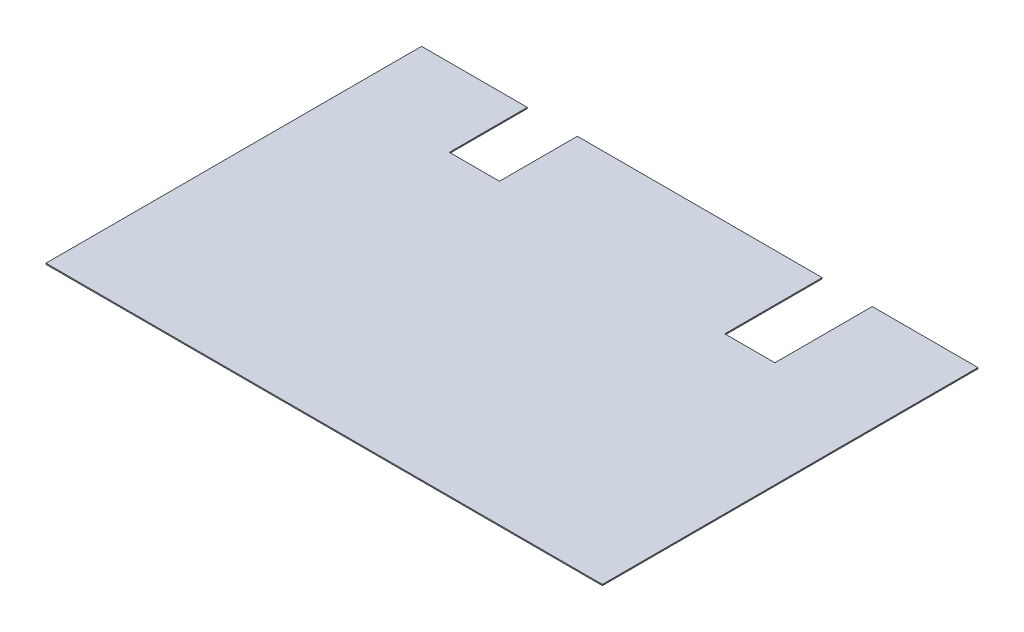
ISO-10303-21;
HEADER;
FILE_DESCRIPTION(('STEP AP214'),'2;1');
FILE_NAME('part.step','',(''),(''),'','','');
FILE_SCHEMA(('AUTOMOTIVE_DESIGN { 1 0 10303 214 1 1 1 1 }'));
ENDSEC;
DATA;
#1=APPLICATION_CONTEXT('core data for automotive mechanical design processes');
#2=APPLICATION_PROTOCOL_DEFINITION('international standard','automotive_design',2000,#1);
#3=PRODUCT_CONTEXT('',#1,'mechanical');
#4=PRODUCT('Part','Part','',(#3));
#5=PRODUCT_RELATED_PRODUCT_CATEGORY('part','',(#4));
#6=PRODUCT_DEFINITION_FORMATION('','',#4);
#7=PRODUCT_DEFINITION_CONTEXT('part definition',#1,'design');
#8=PRODUCT_DEFINITION('design','',#6,#7);
#9=PRODUCT_DEFINITION_SHAPE('','',#8);
#10=(LENGTH_UNIT() NAMED_UNIT(*) SI_UNIT(.MILLI.,.METRE.));
#11=(NAMED_UNIT(*) PLANE_ANGLE_UNIT() SI_UNIT($,.RADIAN.));
#12=(NAMED_UNIT(*) SI_UNIT($,.STERADIAN.) SOLID_ANGLE_UNIT());
#13=UNCERTAINTY_MEASURE_WITH_UNIT(LENGTH_MEASURE(1.E-05),#10,'distance_accuracy_value','');
#14=(GEOMETRIC_REPRESENTATION_CONTEXT(3) GLOBAL_UNCERTAINTY_ASSIGNED_CONTEXT((#13)) GLOBAL_UNIT_ASSIGNED_CONTEXT((#10,
#11,#12)) REPRESENTATION_CONTEXT('',''));
#15=CARTESIAN_POINT('',(0.,0.,0.));
#16=DIRECTION('',(0.,0.,1.));
#17=DIRECTION('',(1.,0.,0.));
#18=AXIS2_PLACEMENT_3D('',#15,#16,#17);
#19=CARTESIAN_POINT('',(0.,0.0508,-17.145));
#20=DIRECTION('',(0.,0.,1.));
#21=DIRECTION('',(1.,0.,0.));
#22=AXIS2_PLACEMENT_3D('',#19,#20,#21);
#23=PLANE('',#22);
#24=DIRECTION('',(-1.,0.,0.));
#25=VECTOR('',#24,1.);
#26=CARTESIAN_POINT('',(0.,0.0508,-17.145));
#27=LINE('',#26,#25);
#28=CARTESIAN_POINT('',(18.288,0.0508,-17.145));
#29=VERTEX_POINT('',#28);
#30=CARTESIAN_POINT('',(7.112,0.0508,-17.145));
#31=VERTEX_POINT('',#30);
#32=EDGE_CURVE('E195',#29,#31,#27,.T.);
#33=ORIENTED_EDGE('',*,*,#32,.F.);
#34=DIRECTION('',(0.,1.,0.));
#35=VECTOR('',#34,1.);
#36=CARTESIAN_POINT('',(18.288,0.,-17.145));
#37=LINE('',#36,#35);
#38=CARTESIAN_POINT('',(18.288,0.,-17.145));
#39=VERTEX_POINT('',#38);
#40=EDGE_CURVE('E151',#39,#29,#37,.T.);
#41=ORIENTED_EDGE('',*,*,#40,.F.);
#42=DIRECTION('',(-1.,0.,0.));
#43=VECTOR('',#42,1.);
#44=CARTESIAN_POINT('',(0.,0.,-17.145));
#45=LINE('',#44,#43);
#46=CARTESIAN_POINT('',(7.112,0.,-17.145));
#47=VERTEX_POINT('',#46);
#48=EDGE_CURVE('E142',#39,#47,#45,.T.);
#49=ORIENTED_EDGE('',*,*,#48,.T.);
#50=DIRECTION('',(0.,1.,0.));
#51=VECTOR('',#50,1.);
#52=CARTESIAN_POINT('',(7.112,0.,-17.145));
#53=LINE('',#52,#51);
#54=EDGE_CURVE('E165',#47,#31,#53,.T.);
#55=ORIENTED_EDGE('',*,*,#54,.T.);
#56=EDGE_LOOP('',(#33,#41,#49,#55));
#57=FACE_BOUND('',#56,.T.);
#58=ADVANCED_FACE('F33',(#57),#23,.F.);
#59=CARTESIAN_POINT('',(25.4,0.,-17.145));
#60=VERTEX_POINT('',#59);
#61=CARTESIAN_POINT('',(20.574,0.,-17.145));
#62=VERTEX_POINT('',#61);
#63=EDGE_CURVE('E186',#60,#62,#45,.T.);
#64=ORIENTED_EDGE('',*,*,#63,.T.);
#65=DIRECTION('',(0.,1.,0.));
#66=VECTOR('',#65,1.);
#67=CARTESIAN_POINT('',(20.574,0.,-17.145));
#68=LINE('',#67,#66);
#69=CARTESIAN_POINT('',(20.574,0.0508,-17.145));
#70=VERTEX_POINT('',#69);
#71=EDGE_CURVE('E154',#62,#70,#68,.T.);
#72=ORIENTED_EDGE('',*,*,#71,.T.);
#73=CARTESIAN_POINT('',(25.4,0.0508,-17.145));
#74=VERTEX_POINT('',#73);
#75=EDGE_CURVE('E191',#74,#70,#27,.T.);
#76=ORIENTED_EDGE('',*,*,#75,.F.);
#77=DIRECTION('',(0.,-1.,0.));
#78=VECTOR('',#77,1.);
#79=CARTESIAN_POINT('',(25.4,0.0508,-17.145));
#80=LINE('',#79,#78);
#81=EDGE_CURVE('E207',#74,#60,#80,.T.);
#82=ORIENTED_EDGE('',*,*,#81,.T.);
#83=EDGE_LOOP('',(#64,#72,#76,#82));
#84=FACE_BOUND('',#83,.T.);
#85=ADVANCED_FACE('F220',(#84),#23,.F.);
#86=CARTESIAN_POINT('',(0.,0.0508,0.));
#87=DIRECTION('',(1.,0.,0.));
#88=DIRECTION('',(0.,0.,-1.));
#89=AXIS2_PLACEMENT_3D('',#86,#87,#88);
#90=PLANE('',#89);
#91=DIRECTION('',(0.,0.,1.));
#92=VECTOR('',#91,1.);
#93=CARTESIAN_POINT('',(0.,0.,0.));
#94=LINE('',#93,#92);
#95=CARTESIAN_POINT('',(0.,0.,-17.145));
#96=VERTEX_POINT('',#95);
#97=CARTESIAN_POINT('',(0.,0.,0.));
#98=VERTEX_POINT('',#97);
#99=EDGE_CURVE('E175',#96,#98,#94,.T.);
#100=ORIENTED_EDGE('',*,*,#99,.T.);
#101=DIRECTION('',(0.,-1.,0.));
#102=VECTOR('',#101,1.);
#103=CARTESIAN_POINT('',(0.,0.0508,0.));
#104=LINE('',#103,#102);
#105=CARTESIAN_POINT('',(0.,0.0508,0.));
#106=VERTEX_POINT('',#105);
#107=EDGE_CURVE('E11',#106,#98,#104,.T.);
#108=ORIENTED_EDGE('',*,*,#107,.F.);
#109=DIRECTION('',(0.,0.,1.));
#110=VECTOR('',#109,1.);
#111=CARTESIAN_POINT('',(0.,0.0508,0.));
#112=LINE('',#111,#110);
#113=CARTESIAN_POINT('',(0.,0.0508,-17.145));
#114=VERTEX_POINT('',#113);
#115=EDGE_CURVE('E182',#114,#106,#112,.T.);
#116=ORIENTED_EDGE('',*,*,#115,.F.);
#117=DIRECTION('',(0.,-1.,0.));
#118=VECTOR('',#117,1.);
#119=CARTESIAN_POINT('',(0.,0.0508,-17.145));
#120=LINE('',#119,#118);
#121=EDGE_CURVE('E194',#114,#96,#120,.T.);
#122=ORIENTED_EDGE('',*,*,#121,.T.);
#123=EDGE_LOOP('',(#100,#108,#116,#122));
#124=FACE_BOUND('',#123,.T.);
#125=ADVANCED_FACE('F35',(#124),#90,.F.);
#126=CARTESIAN_POINT('',(0.,0.0508,0.));
#127=DIRECTION('',(0.,0.,-1.));
#128=DIRECTION('',(-1.,0.,0.));
#129=AXIS2_PLACEMENT_3D('',#126,#127,#128);
#130=PLANE('',#129);
#131=DIRECTION('',(1.,0.,0.));
#132=VECTOR('',#131,1.);
#133=CARTESIAN_POINT('',(0.,0.,0.));
#134=LINE('',#133,#132);
#135=CARTESIAN_POINT('',(25.4,0.,0.));
#136=VERTEX_POINT('',#135);
#137=EDGE_CURVE('E198',#98,#136,#134,.T.);
#138=ORIENTED_EDGE('',*,*,#137,.T.);
#139=DIRECTION('',(0.,-1.,0.));
#140=VECTOR('',#139,1.);
#141=CARTESIAN_POINT('',(25.4,0.0508,0.));
#142=LINE('',#141,#140);
#143=CARTESIAN_POINT('',(25.4,0.0508,0.));
#144=VERTEX_POINT('',#143);
#145=EDGE_CURVE('E41',#144,#136,#142,.T.);
#146=ORIENTED_EDGE('',*,*,#145,.F.);
#147=DIRECTION('',(1.,0.,0.));
#148=VECTOR('',#147,1.);
#149=CARTESIAN_POINT('',(0.,0.0508,0.));
#150=LINE('',#149,#148);
#151=EDGE_CURVE('E185',#106,#144,#150,.T.);
#152=ORIENTED_EDGE('',*,*,#151,.F.);
#153=ORIENTED_EDGE('',*,*,#107,.T.);
#154=EDGE_LOOP('',(#138,#146,#152,#153));
#155=FACE_BOUND('',#154,.T.);
#156=ADVANCED_FACE('F227',(#155),#130,.F.);
#157=CARTESIAN_POINT('',(25.4,0.0508,0.));
#158=DIRECTION('',(-1.,0.,0.));
#159=DIRECTION('',(0.,0.,1.));
#160=AXIS2_PLACEMENT_3D('',#157,#158,#159);
#161=PLANE('',#160);
#162=DIRECTION('',(0.,0.,-1.));
#163=VECTOR('',#162,1.);
#164=CARTESIAN_POINT('',(25.4,0.,0.));
#165=LINE('',#164,#163);
#166=EDGE_CURVE('E200',#136,#60,#165,.T.);
#167=ORIENTED_EDGE('',*,*,#166,.T.);
#168=ORIENTED_EDGE('',*,*,#81,.F.);
#169=DIRECTION('',(0.,0.,-1.));
#170=VECTOR('',#169,1.);
#171=CARTESIAN_POINT('',(25.4,0.0508,0.));
#172=LINE('',#171,#170);
#173=EDGE_CURVE('E188',#144,#74,#172,.T.);
#174=ORIENTED_EDGE('',*,*,#173,.F.);
#175=ORIENTED_EDGE('',*,*,#145,.T.);
#176=EDGE_LOOP('',(#167,#168,#174,#175));
#177=FACE_BOUND('',#176,.T.);
#178=ADVANCED_FACE('F214',(#177),#161,.F.);
#179=CARTESIAN_POINT('',(4.826,0.0508,-17.145));
#180=VERTEX_POINT('',#179);
#181=EDGE_CURVE('E190',#180,#114,#27,.T.);
#182=ORIENTED_EDGE('',*,*,#181,.F.);
#183=DIRECTION('',(0.,1.,0.));
#184=VECTOR('',#183,1.);
#185=CARTESIAN_POINT('',(4.826,0.,-17.145));
#186=LINE('',#185,#184);
#187=CARTESIAN_POINT('',(4.826,0.,-17.145));
#188=VERTEX_POINT('',#187);
#189=EDGE_CURVE('E178',#188,#180,#186,.T.);
#190=ORIENTED_EDGE('',*,*,#189,.F.);
#191=EDGE_CURVE('E202',#188,#96,#45,.T.);
#192=ORIENTED_EDGE('',*,*,#191,.T.);
#193=ORIENTED_EDGE('',*,*,#121,.F.);
#194=EDGE_LOOP('',(#182,#190,#192,#193));
#195=FACE_BOUND('',#194,.T.);
#196=ADVANCED_FACE('F243',(#195),#23,.F.);
#197=CARTESIAN_POINT('',(0.,0.0508,0.));
#198=DIRECTION('',(0.,-1.,0.));
#199=DIRECTION('',(0.,0.,-1.));
#200=AXIS2_PLACEMENT_3D('',#197,#198,#199);
#201=PLANE('',#200);
#202=DIRECTION('',(1.,0.,0.));
#203=VECTOR('',#202,1.);
#204=CARTESIAN_POINT('',(18.288,0.0508,-12.7));
#205=LINE('',#204,#203);
#206=CARTESIAN_POINT('',(18.288,0.0508,-12.7));
#207=VERTEX_POINT('',#206);
#208=CARTESIAN_POINT('',(20.574,0.0508,-12.7));
#209=VERTEX_POINT('',#208);
#210=EDGE_CURVE('E145',#207,#209,#205,.T.);
#211=ORIENTED_EDGE('',*,*,#210,.F.);
#212=DIRECTION('',(0.,0.,1.));
#213=VECTOR('',#212,1.);
#214=CARTESIAN_POINT('',(18.288,0.0508,-17.145));
#215=LINE('',#214,#213);
#216=EDGE_CURVE('E128',#29,#207,#215,.T.);
#217=ORIENTED_EDGE('',*,*,#216,.F.);
#218=ORIENTED_EDGE('',*,*,#32,.T.);
#219=DIRECTION('',(0.,0.,-1.));
#220=VECTOR('',#219,1.);
#221=CARTESIAN_POINT('',(7.112,0.0508,-17.145));
#222=LINE('',#221,#220);
#223=CARTESIAN_POINT('',(7.112,0.0508,-13.589));
#224=VERTEX_POINT('',#223);
#225=EDGE_CURVE('E153',#224,#31,#222,.T.);
#226=ORIENTED_EDGE('',*,*,#225,.F.);
#227=DIRECTION('',(1.,0.,0.));
#228=VECTOR('',#227,1.);
#229=CARTESIAN_POINT('',(4.826,0.0508,-13.589));
#230=LINE('',#229,#228);
#231=CARTESIAN_POINT('',(4.826,0.0508,-13.589));
#232=VERTEX_POINT('',#231);
#233=EDGE_CURVE('E161',#232,#224,#230,.T.);
#234=ORIENTED_EDGE('',*,*,#233,.F.);
#235=DIRECTION('',(0.,0.,1.));
#236=VECTOR('',#235,1.);
#237=CARTESIAN_POINT('',(4.826,0.0508,-14.605));
#238=LINE('',#237,#236);
#239=EDGE_CURVE('E168',#180,#232,#238,.T.);
#240=ORIENTED_EDGE('',*,*,#239,.F.);
#241=ORIENTED_EDGE('',*,*,#181,.T.);
#242=ORIENTED_EDGE('',*,*,#115,.T.);
#243=ORIENTED_EDGE('',*,*,#151,.T.);
#244=ORIENTED_EDGE('',*,*,#173,.T.);
#245=ORIENTED_EDGE('',*,*,#75,.T.);
#246=DIRECTION('',(0.,0.,-1.));
#247=VECTOR('',#246,1.);
#248=CARTESIAN_POINT('',(20.574,0.0508,-13.589));
#249=LINE('',#248,#247);
#250=EDGE_CURVE('E143',#209,#70,#249,.T.);
#251=ORIENTED_EDGE('',*,*,#250,.F.);
#252=EDGE_LOOP('',(#211,#217,#218,#226,#234,#240,#241,#242,#243,#244,#245,#251));
#253=FACE_BOUND('',#252,.T.);
#254=ADVANCED_FACE('F224',(#253),#201,.F.);
#255=CARTESIAN_POINT('',(0.,0.,0.));
#256=DIRECTION('',(0.,-1.,0.));
#257=DIRECTION('',(0.,0.,-1.));
#258=AXIS2_PLACEMENT_3D('',#255,#256,#257);
#259=PLANE('',#258);
#260=DIRECTION('',(0.,0.,1.));
#261=VECTOR('',#260,1.);
#262=CARTESIAN_POINT('',(18.288,0.,-17.145));
#263=LINE('',#262,#261);
#264=CARTESIAN_POINT('',(18.288,0.,-12.7));
#265=VERTEX_POINT('',#264);
#266=EDGE_CURVE('E125',#39,#265,#263,.T.);
#267=ORIENTED_EDGE('',*,*,#266,.T.);
#268=DIRECTION('',(1.,0.,0.));
#269=VECTOR('',#268,1.);
#270=CARTESIAN_POINT('',(18.288,0.,-12.7));
#271=LINE('',#270,#269);
#272=CARTESIAN_POINT('',(20.574,0.,-12.7));
#273=VERTEX_POINT('',#272);
#274=EDGE_CURVE('E135',#265,#273,#271,.T.);
#275=ORIENTED_EDGE('',*,*,#274,.T.);
#276=DIRECTION('',(0.,0.,-1.));
#277=VECTOR('',#276,1.);
#278=CARTESIAN_POINT('',(20.574,0.,-13.589));
#279=LINE('',#278,#277);
#280=EDGE_CURVE('E48',#273,#62,#279,.T.);
#281=ORIENTED_EDGE('',*,*,#280,.T.);
#282=ORIENTED_EDGE('',*,*,#63,.F.);
#283=ORIENTED_EDGE('',*,*,#166,.F.);
#284=ORIENTED_EDGE('',*,*,#137,.F.);
#285=ORIENTED_EDGE('',*,*,#99,.F.);
#286=ORIENTED_EDGE('',*,*,#191,.F.);
#287=DIRECTION('',(0.,0.,1.));
#288=VECTOR('',#287,1.);
#289=CARTESIAN_POINT('',(4.826,0.,-14.605));
#290=LINE('',#289,#288);
#291=CARTESIAN_POINT('',(4.826,0.,-13.589));
#292=VERTEX_POINT('',#291);
#293=EDGE_CURVE('E160',#188,#292,#290,.T.);
#294=ORIENTED_EDGE('',*,*,#293,.T.);
#295=DIRECTION('',(1.,0.,0.));
#296=VECTOR('',#295,1.);
#297=CARTESIAN_POINT('',(4.826,0.,-13.589));
#298=LINE('',#297,#296);
#299=CARTESIAN_POINT('',(7.112,0.,-13.589));
#300=VERTEX_POINT('',#299);
#301=EDGE_CURVE('E56',#292,#300,#298,.T.);
#302=ORIENTED_EDGE('',*,*,#301,.T.);
#303=DIRECTION('',(0.,0.,-1.));
#304=VECTOR('',#303,1.);
#305=CARTESIAN_POINT('',(7.112,0.,-17.145));
#306=LINE('',#305,#304);
#307=EDGE_CURVE('E158',#300,#47,#306,.T.);
#308=ORIENTED_EDGE('',*,*,#307,.T.);
#309=ORIENTED_EDGE('',*,*,#48,.F.);
#310=EDGE_LOOP('',(#267,#275,#281,#282,#283,#284,#285,#286,#294,#302,#308,#309));
#311=FACE_BOUND('',#310,.T.);
#312=ADVANCED_FACE('F140',(#311),#259,.T.);
#313=CARTESIAN_POINT('',(7.112,0.,-17.145));
#314=DIRECTION('',(1.,0.,0.));
#315=DIRECTION('',(0.,0.,-1.));
#316=AXIS2_PLACEMENT_3D('',#313,#314,#315);
#317=PLANE('',#316);
#318=ORIENTED_EDGE('',*,*,#225,.T.);
#319=ORIENTED_EDGE('',*,*,#54,.F.);
#320=ORIENTED_EDGE('',*,*,#307,.F.);
#321=DIRECTION('',(0.,1.,0.));
#322=VECTOR('',#321,1.);
#323=CARTESIAN_POINT('',(7.112,0.,-13.589));
#324=LINE('',#323,#322);
#325=EDGE_CURVE('E173',#300,#224,#324,.T.);
#326=ORIENTED_EDGE('',*,*,#325,.T.);
#327=EDGE_LOOP('',(#318,#319,#320,#326));
#328=FACE_BOUND('',#327,.T.);
#329=ADVANCED_FACE('F238',(#328),#317,.F.);
#330=CARTESIAN_POINT('',(4.826,0.,-13.589));
#331=DIRECTION('',(0.,0.,1.));
#332=DIRECTION('',(1.,0.,0.));
#333=AXIS2_PLACEMENT_3D('',#330,#331,#332);
#334=PLANE('',#333);
#335=ORIENTED_EDGE('',*,*,#233,.T.);
#336=ORIENTED_EDGE('',*,*,#325,.F.);
#337=ORIENTED_EDGE('',*,*,#301,.F.);
#338=DIRECTION('',(0.,1.,0.));
#339=VECTOR('',#338,1.);
#340=CARTESIAN_POINT('',(4.826,0.,-13.589));
#341=LINE('',#340,#339);
#342=EDGE_CURVE('E176',#292,#232,#341,.T.);
#343=ORIENTED_EDGE('',*,*,#342,.T.);
#344=EDGE_LOOP('',(#335,#336,#337,#343));
#345=FACE_BOUND('',#344,.T.);
#346=ADVANCED_FACE('F303',(#345),#334,.F.);
#347=CARTESIAN_POINT('',(4.826,0.,-14.605));
#348=DIRECTION('',(-1.,0.,0.));
#349=DIRECTION('',(0.,0.,1.));
#350=AXIS2_PLACEMENT_3D('',#347,#348,#349);
#351=PLANE('',#350);
#352=ORIENTED_EDGE('',*,*,#239,.T.);
#353=ORIENTED_EDGE('',*,*,#342,.F.);
#354=ORIENTED_EDGE('',*,*,#293,.F.);
#355=ORIENTED_EDGE('',*,*,#189,.T.);
#356=EDGE_LOOP('',(#352,#353,#354,#355));
#357=FACE_BOUND('',#356,.T.);
#358=ADVANCED_FACE('F312',(#357),#351,.F.);
#359=CARTESIAN_POINT('',(18.288,0.,-17.145));
#360=DIRECTION('',(-1.,0.,0.));
#361=DIRECTION('',(0.,0.,1.));
#362=AXIS2_PLACEMENT_3D('',#359,#360,#361);
#363=PLANE('',#362);
#364=ORIENTED_EDGE('',*,*,#216,.T.);
#365=DIRECTION('',(0.,1.,0.));
#366=VECTOR('',#365,1.);
#367=CARTESIAN_POINT('',(18.288,0.,-12.7));
#368=LINE('',#367,#366);
#369=EDGE_CURVE('E121',#265,#207,#368,.T.);
#370=ORIENTED_EDGE('',*,*,#369,.F.);
#371=ORIENTED_EDGE('',*,*,#266,.F.);
#372=ORIENTED_EDGE('',*,*,#40,.T.);
#373=EDGE_LOOP('',(#364,#370,#371,#372));
#374=FACE_BOUND('',#373,.T.);
#375=ADVANCED_FACE('F123',(#374),#363,.F.);
#376=CARTESIAN_POINT('',(20.574,0.,-13.589));
#377=DIRECTION('',(1.,0.,0.));
#378=DIRECTION('',(0.,0.,-1.));
#379=AXIS2_PLACEMENT_3D('',#376,#377,#378);
#380=PLANE('',#379);
#381=ORIENTED_EDGE('',*,*,#250,.T.);
#382=ORIENTED_EDGE('',*,*,#71,.F.);
#383=ORIENTED_EDGE('',*,*,#280,.F.);
#384=DIRECTION('',(0.,1.,0.));
#385=VECTOR('',#384,1.);
#386=CARTESIAN_POINT('',(20.574,0.,-12.7));
#387=LINE('',#386,#385);
#388=EDGE_CURVE('E132',#273,#209,#387,.T.);
#389=ORIENTED_EDGE('',*,*,#388,.T.);
#390=EDGE_LOOP('',(#381,#382,#383,#389));
#391=FACE_BOUND('',#390,.T.);
#392=ADVANCED_FACE('F331',(#391),#380,.F.);
#393=CARTESIAN_POINT('',(18.288,0.,-12.7));
#394=DIRECTION('',(0.,0.,1.));
#395=DIRECTION('',(1.,0.,0.));
#396=AXIS2_PLACEMENT_3D('',#393,#394,#395);
#397=PLANE('',#396);
#398=ORIENTED_EDGE('',*,*,#210,.T.);
#399=ORIENTED_EDGE('',*,*,#388,.F.);
#400=ORIENTED_EDGE('',*,*,#274,.F.);
#401=ORIENTED_EDGE('',*,*,#369,.T.);
#402=EDGE_LOOP('',(#398,#399,#400,#401));
#403=FACE_BOUND('',#402,.T.);
#404=ADVANCED_FACE('F136',(#403),#397,.F.);
#405=CLOSED_SHELL('',(#58,#85,#125,#156,#178,#196,#254,#312,#329,#346,#358,#375,#392,#404));
#406=MANIFOLD_SOLID_BREP('B2',#405);
#407=ADVANCED_BREP_SHAPE_REPRESENTATION('',(#18,#406),#14);
#408=SHAPE_DEFINITION_REPRESENTATION(#9,#407);
ENDSEC;
END-ISO-10303-21;
